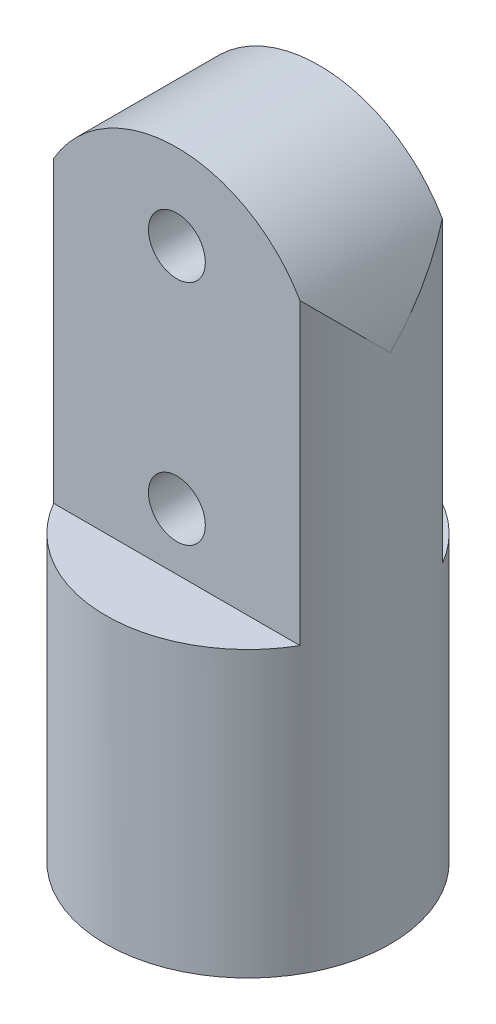
ISO-10303-21;
HEADER;
FILE_DESCRIPTION(('STEP AP214'),'2;1');
FILE_NAME('part.step','',(''),(''),'','','');
FILE_SCHEMA(('AUTOMOTIVE_DESIGN { 1 0 10303 214 1 1 1 1 }'));
ENDSEC;
DATA;
#1=APPLICATION_CONTEXT('core data for automotive mechanical design processes');
#2=APPLICATION_PROTOCOL_DEFINITION('international standard','automotive_design',2000,#1);
#3=PRODUCT_CONTEXT('',#1,'mechanical');
#4=PRODUCT('Part','Part','',(#3));
#5=PRODUCT_RELATED_PRODUCT_CATEGORY('part','',(#4));
#6=PRODUCT_DEFINITION_FORMATION('','',#4);
#7=PRODUCT_DEFINITION_CONTEXT('part definition',#1,'design');
#8=PRODUCT_DEFINITION('design','',#6,#7);
#9=PRODUCT_DEFINITION_SHAPE('','',#8);
#10=(LENGTH_UNIT() NAMED_UNIT(*) SI_UNIT(.MILLI.,.METRE.));
#11=(NAMED_UNIT(*) PLANE_ANGLE_UNIT() SI_UNIT($,.RADIAN.));
#12=(NAMED_UNIT(*) SI_UNIT($,.STERADIAN.) SOLID_ANGLE_UNIT());
#13=UNCERTAINTY_MEASURE_WITH_UNIT(LENGTH_MEASURE(1.E-05),#10,'distance_accuracy_value','');
#14=(GEOMETRIC_REPRESENTATION_CONTEXT(3) GLOBAL_UNCERTAINTY_ASSIGNED_CONTEXT((#13)) GLOBAL_UNIT_ASSIGNED_CONTEXT((#10,
#11,#12)) REPRESENTATION_CONTEXT('',''));
#15=CARTESIAN_POINT('',(0.,0.,0.));
#16=DIRECTION('',(0.,0.,1.));
#17=DIRECTION('',(1.,0.,0.));
#18=AXIS2_PLACEMENT_3D('',#15,#16,#17);
#19=CARTESIAN_POINT('',(0.,90.,-12.5));
#20=DIRECTION('',(0.,0.,-1.));
#21=DIRECTION('',(-1.,0.,0.));
#22=AXIS2_PLACEMENT_3D('',#19,#20,#21);
#23=PLANE('',#22);
#24=CARTESIAN_POINT('',(0.,100.,-12.5));
#25=DIRECTION('',(0.,0.,-1.));
#26=DIRECTION('',(-1.,0.,0.));
#27=AXIS2_PLACEMENT_3D('',#24,#25,#26);
#28=CIRCLE('',#27,5.00000000000001);
#29=CARTESIAN_POINT('',(-5.00000000000001,100.,-12.5));
#30=VERTEX_POINT('',#29);
#31=EDGE_CURVE('E140',#30,#30,#28,.T.);
#32=ORIENTED_EDGE('',*,*,#31,.F.);
#33=EDGE_LOOP('',(#32));
#34=FACE_BOUND('',#33,.T.);
#35=CARTESIAN_POINT('',(0.,60.,-12.5));
#36=DIRECTION('',(0.,0.,-1.));
#37=DIRECTION('',(-1.,0.,0.));
#38=AXIS2_PLACEMENT_3D('',#35,#36,#37);
#39=CIRCLE('',#38,5.);
#40=CARTESIAN_POINT('',(-5.,60.,-12.5));
#41=VERTEX_POINT('',#40);
#42=EDGE_CURVE('E145',#41,#41,#39,.T.);
#43=ORIENTED_EDGE('',*,*,#42,.F.);
#44=EDGE_LOOP('',(#43));
#45=FACE_BOUND('',#44,.T.);
#46=CARTESIAN_POINT('',(0.,90.,-12.5));
#47=DIRECTION('',(0.,0.,1.));
#48=DIRECTION('',(-1.,0.,0.));
#49=AXIS2_PLACEMENT_3D('',#46,#47,#48);
#50=CIRCLE('',#49,25.);
#51=CARTESIAN_POINT('',(21.650635094611,102.5,-12.5));
#52=VERTEX_POINT('',#51);
#53=CARTESIAN_POINT('',(-21.650635094611,102.5,-12.5));
#54=VERTEX_POINT('',#53);
#55=EDGE_CURVE('E92',#52,#54,#50,.T.);
#56=ORIENTED_EDGE('',*,*,#55,.F.);
#57=DIRECTION('',(0.,-1.,0.));
#58=VECTOR('',#57,1.);
#59=CARTESIAN_POINT('',(21.650635094611,115.,-12.5));
#60=LINE('',#59,#58);
#61=CARTESIAN_POINT('',(21.650635094611,50.,-12.5));
#62=VERTEX_POINT('',#61);
#63=EDGE_CURVE('E91',#52,#62,#60,.T.);
#64=ORIENTED_EDGE('',*,*,#63,.T.);
#65=DIRECTION('',(1.,0.,0.));
#66=VECTOR('',#65,1.);
#67=CARTESIAN_POINT('',(-25.,50.,-12.5));
#68=LINE('',#67,#66);
#69=CARTESIAN_POINT('',(-21.650635094611,50.,-12.5));
#70=VERTEX_POINT('',#69);
#71=EDGE_CURVE('E11',#70,#62,#68,.T.);
#72=ORIENTED_EDGE('',*,*,#71,.F.);
#73=DIRECTION('',(0.,-1.,0.));
#74=VECTOR('',#73,1.);
#75=CARTESIAN_POINT('',(-21.650635094611,115.,-12.5));
#76=LINE('',#75,#74);
#77=EDGE_CURVE('E57',#54,#70,#76,.T.);
#78=ORIENTED_EDGE('',*,*,#77,.F.);
#79=EDGE_LOOP('',(#56,#64,#72,#78));
#80=FACE_BOUND('',#79,.T.);
#81=ADVANCED_FACE('F39',(#34,#45,#80),#23,.T.);
#82=CARTESIAN_POINT('',(0.,90.,12.5));
#83=DIRECTION('',(0.,0.,-1.));
#84=DIRECTION('',(-1.,0.,0.));
#85=AXIS2_PLACEMENT_3D('',#82,#83,#84);
#86=CYLINDRICAL_SURFACE('',#85,25.);
#87=CARTESIAN_POINT('',(0.,90.,0.));
#88=DIRECTION('',(0.,-0.707106781186547,-0.707106781186547));
#89=DIRECTION('',(0.,0.707106781186547,-0.707106781186547));
#90=AXIS2_PLACEMENT_3D('',#87,#88,#89);
#91=ELLIPSE('',#90,35.3553390593274,25.);
#92=CARTESIAN_POINT('',(25.,90.,0.));
#93=VERTEX_POINT('',#92);
#94=EDGE_CURVE('E95',#52,#93,#91,.T.);
#95=ORIENTED_EDGE('',*,*,#94,.F.);
#96=ORIENTED_EDGE('',*,*,#55,.T.);
#97=CARTESIAN_POINT('',(0.,90.,0.));
#98=DIRECTION('',(0.,-0.707106781186547,-0.707106781186547));
#99=DIRECTION('',(0.,0.707106781186547,-0.707106781186547));
#100=AXIS2_PLACEMENT_3D('',#97,#98,#99);
#101=ELLIPSE('',#100,35.3553390593274,25.);
#102=CARTESIAN_POINT('',(-25.,90.,0.));
#103=VERTEX_POINT('',#102);
#104=EDGE_CURVE('E119',#103,#54,#101,.T.);
#105=ORIENTED_EDGE('',*,*,#104,.F.);
#106=CARTESIAN_POINT('',(0.,90.,0.));
#107=DIRECTION('',(0.,0.707106781186547,-0.707106781186547));
#108=DIRECTION('',(0.,-0.707106781186547,-0.707106781186547));
#109=AXIS2_PLACEMENT_3D('',#106,#107,#108);
#110=ELLIPSE('',#109,35.3553390593274,25.);
#111=CARTESIAN_POINT('',(-21.650635094611,102.5,12.5));
#112=VERTEX_POINT('',#111);
#113=EDGE_CURVE('E132',#112,#103,#110,.F.);
#114=ORIENTED_EDGE('',*,*,#113,.F.);
#115=CARTESIAN_POINT('',(0.,90.,12.5));
#116=DIRECTION('',(0.,0.,1.));
#117=DIRECTION('',(-1.,0.,0.));
#118=AXIS2_PLACEMENT_3D('',#115,#116,#117);
#119=CIRCLE('',#118,25.);
#120=CARTESIAN_POINT('',(21.650635094611,102.5,12.5));
#121=VERTEX_POINT('',#120);
#122=EDGE_CURVE('E117',#121,#112,#119,.T.);
#123=ORIENTED_EDGE('',*,*,#122,.F.);
#124=CARTESIAN_POINT('',(0.,90.,0.));
#125=DIRECTION('',(0.,0.707106781186547,-0.707106781186547));
#126=DIRECTION('',(0.,-0.707106781186547,-0.707106781186547));
#127=AXIS2_PLACEMENT_3D('',#124,#125,#126);
#128=ELLIPSE('',#127,35.3553390593274,25.);
#129=EDGE_CURVE('E126',#121,#93,#128,.T.);
#130=ORIENTED_EDGE('',*,*,#129,.T.);
#131=EDGE_LOOP('',(#95,#96,#105,#114,#123,#130));
#132=FACE_BOUND('',#131,.T.);
#133=ADVANCED_FACE('F163',(#132),#86,.T.);
#134=CARTESIAN_POINT('',(0.,90.,12.5));
#135=DIRECTION('',(0.,0.,-1.));
#136=DIRECTION('',(-1.,0.,0.));
#137=AXIS2_PLACEMENT_3D('',#134,#135,#136);
#138=PLANE('',#137);
#139=CARTESIAN_POINT('',(0.,100.,12.5));
#140=DIRECTION('',(0.,0.,1.));
#141=DIRECTION('',(1.,0.,0.));
#142=AXIS2_PLACEMENT_3D('',#139,#140,#141);
#143=CIRCLE('',#142,5.00000000000001);
#144=CARTESIAN_POINT('',(5.00000000000001,100.,12.5));
#145=VERTEX_POINT('',#144);
#146=EDGE_CURVE('E149',#145,#145,#143,.T.);
#147=ORIENTED_EDGE('',*,*,#146,.F.);
#148=EDGE_LOOP('',(#147));
#149=FACE_BOUND('',#148,.T.);
#150=CARTESIAN_POINT('',(0.,60.,12.5));
#151=DIRECTION('',(0.,0.,1.));
#152=DIRECTION('',(1.,0.,0.));
#153=AXIS2_PLACEMENT_3D('',#150,#151,#152);
#154=CIRCLE('',#153,5.);
#155=CARTESIAN_POINT('',(5.,60.,12.5));
#156=VERTEX_POINT('',#155);
#157=EDGE_CURVE('E150',#156,#156,#154,.T.);
#158=ORIENTED_EDGE('',*,*,#157,.F.);
#159=EDGE_LOOP('',(#158));
#160=FACE_BOUND('',#159,.T.);
#161=DIRECTION('',(0.,-1.,0.));
#162=VECTOR('',#161,1.);
#163=CARTESIAN_POINT('',(-21.650635094611,115.,12.5));
#164=LINE('',#163,#162);
#165=CARTESIAN_POINT('',(-21.650635094611,50.,12.5));
#166=VERTEX_POINT('',#165);
#167=EDGE_CURVE('E96',#112,#166,#164,.T.);
#168=ORIENTED_EDGE('',*,*,#167,.T.);
#169=DIRECTION('',(1.,0.,0.));
#170=VECTOR('',#169,1.);
#171=CARTESIAN_POINT('',(-25.,50.,12.5));
#172=LINE('',#171,#170);
#173=CARTESIAN_POINT('',(21.650635094611,50.,12.5));
#174=VERTEX_POINT('',#173);
#175=EDGE_CURVE('E49',#166,#174,#172,.T.);
#176=ORIENTED_EDGE('',*,*,#175,.T.);
#177=DIRECTION('',(0.,-1.,0.));
#178=VECTOR('',#177,1.);
#179=CARTESIAN_POINT('',(21.650635094611,115.,12.5));
#180=LINE('',#179,#178);
#181=EDGE_CURVE('E64',#121,#174,#180,.T.);
#182=ORIENTED_EDGE('',*,*,#181,.F.);
#183=ORIENTED_EDGE('',*,*,#122,.T.);
#184=EDGE_LOOP('',(#168,#176,#182,#183));
#185=FACE_BOUND('',#184,.T.);
#186=ADVANCED_FACE('F160',(#149,#160,#185),#138,.F.);
#187=CARTESIAN_POINT('',(0.,50.,0.));
#188=DIRECTION('',(0.,1.,0.));
#189=DIRECTION('',(0.,0.,1.));
#190=AXIS2_PLACEMENT_3D('',#187,#188,#189);
#191=PLANE('',#190);
#192=CARTESIAN_POINT('',(0.,50.,0.));
#193=DIRECTION('',(0.,1.,0.));
#194=DIRECTION('',(0.,0.,1.));
#195=AXIS2_PLACEMENT_3D('',#192,#193,#194);
#196=CIRCLE('',#195,25.);
#197=EDGE_CURVE('E100',#62,#70,#196,.T.);
#198=ORIENTED_EDGE('',*,*,#197,.T.);
#199=ORIENTED_EDGE('',*,*,#71,.T.);
#200=EDGE_LOOP('',(#198,#199));
#201=FACE_BOUND('',#200,.T.);
#202=ADVANCED_FACE('F99',(#201),#191,.T.);
#203=ORIENTED_EDGE('',*,*,#175,.F.);
#204=EDGE_CURVE('E103',#166,#174,#196,.T.);
#205=ORIENTED_EDGE('',*,*,#204,.T.);
#206=EDGE_LOOP('',(#203,#205));
#207=FACE_BOUND('',#206,.T.);
#208=ADVANCED_FACE('F171',(#207),#191,.T.);
#209=CARTESIAN_POINT('',(0.,0.,0.));
#210=DIRECTION('',(0.,1.,0.));
#211=DIRECTION('',(0.,0.,1.));
#212=AXIS2_PLACEMENT_3D('',#209,#210,#211);
#213=PLANE('',#212);
#214=CARTESIAN_POINT('',(0.,0.,0.));
#215=DIRECTION('',(0.,1.,0.));
#216=DIRECTION('',(0.,0.,1.));
#217=AXIS2_PLACEMENT_3D('',#214,#215,#216);
#218=CIRCLE('',#217,25.);
#219=CARTESIAN_POINT('',(0.,0.,25.));
#220=VERTEX_POINT('',#219);
#221=EDGE_CURVE('E43',#220,#220,#218,.T.);
#222=ORIENTED_EDGE('',*,*,#221,.F.);
#223=EDGE_LOOP('',(#222));
#224=FACE_BOUND('',#223,.T.);
#225=CARTESIAN_POINT('',(0.,0.,0.));
#226=DIRECTION('',(0.,1.,0.));
#227=DIRECTION('',(0.,0.,1.));
#228=AXIS2_PLACEMENT_3D('',#225,#226,#227);
#229=CIRCLE('',#228,10.);
#230=CARTESIAN_POINT('',(0.,0.,10.));
#231=VERTEX_POINT('',#230);
#232=EDGE_CURVE('E109',#231,#231,#229,.T.);
#233=ORIENTED_EDGE('',*,*,#232,.T.);
#234=EDGE_LOOP('',(#233));
#235=FACE_BOUND('',#234,.T.);
#236=ADVANCED_FACE('F173',(#224,#235),#213,.F.);
#237=CARTESIAN_POINT('',(0.,50.,0.));
#238=DIRECTION('',(0.,-1.,0.));
#239=DIRECTION('',(0.,0.,-1.));
#240=AXIS2_PLACEMENT_3D('',#237,#238,#239);
#241=CYLINDRICAL_SURFACE('',#240,25.);
#242=ORIENTED_EDGE('',*,*,#197,.F.);
#243=ORIENTED_EDGE('',*,*,#63,.F.);
#244=ORIENTED_EDGE('',*,*,#94,.T.);
#245=ORIENTED_EDGE('',*,*,#129,.F.);
#246=ORIENTED_EDGE('',*,*,#181,.T.);
#247=ORIENTED_EDGE('',*,*,#204,.F.);
#248=ORIENTED_EDGE('',*,*,#167,.F.);
#249=ORIENTED_EDGE('',*,*,#113,.T.);
#250=ORIENTED_EDGE('',*,*,#104,.T.);
#251=ORIENTED_EDGE('',*,*,#77,.T.);
#252=EDGE_LOOP('',(#242,#243,#244,#245,#246,#247,#248,#249,#250,#251));
#253=FACE_BOUND('',#252,.T.);
#254=ORIENTED_EDGE('',*,*,#221,.T.);
#255=EDGE_LOOP('',(#254));
#256=FACE_BOUND('',#255,.T.);
#257=ADVANCED_FACE('F41',(#253,#256),#241,.T.);
#258=CARTESIAN_POINT('',(0.,50.,0.));
#259=DIRECTION('',(0.,-1.,0.));
#260=DIRECTION('',(0.,0.,-1.));
#261=AXIS2_PLACEMENT_3D('',#258,#259,#260);
#262=CYLINDRICAL_SURFACE('',#261,10.);
#263=CARTESIAN_POINT('',(0.,50.,0.));
#264=DIRECTION('',(0.,1.,0.));
#265=DIRECTION('',(0.,0.,1.));
#266=AXIS2_PLACEMENT_3D('',#263,#264,#265);
#267=CIRCLE('',#266,10.);
#268=CARTESIAN_POINT('',(0.,50.,10.));
#269=VERTEX_POINT('',#268);
#270=EDGE_CURVE('E113',#269,#269,#267,.T.);
#271=ORIENTED_EDGE('',*,*,#270,.T.);
#272=EDGE_LOOP('',(#271));
#273=FACE_BOUND('',#272,.T.);
#274=ORIENTED_EDGE('',*,*,#232,.F.);
#275=EDGE_LOOP('',(#274));
#276=FACE_BOUND('',#275,.T.);
#277=ADVANCED_FACE('F196',(#273,#276),#262,.F.);
#278=CARTESIAN_POINT('',(-25.,50.,12.5));
#279=DIRECTION('',(0.,1.,0.));
#280=DIRECTION('',(0.,0.,1.));
#281=AXIS2_PLACEMENT_3D('',#278,#279,#280);
#282=PLANE('',#281);
#283=ORIENTED_EDGE('',*,*,#270,.F.);
#284=EDGE_LOOP('',(#283));
#285=FACE_BOUND('',#284,.T.);
#286=ADVANCED_FACE('F193',(#285),#282,.F.);
#287=CARTESIAN_POINT('',(0.,60.,-25.));
#288=DIRECTION('',(0.,0.,1.));
#289=DIRECTION('',(1.,0.,0.));
#290=AXIS2_PLACEMENT_3D('',#287,#288,#289);
#291=CYLINDRICAL_SURFACE('',#290,5.);
#292=ORIENTED_EDGE('',*,*,#42,.T.);
#293=EDGE_LOOP('',(#292));
#294=FACE_BOUND('',#293,.T.);
#295=ORIENTED_EDGE('',*,*,#157,.T.);
#296=EDGE_LOOP('',(#295));
#297=FACE_BOUND('',#296,.T.);
#298=ADVANCED_FACE('F195',(#294,#297),#291,.F.);
#299=CARTESIAN_POINT('',(0.,100.,-25.));
#300=DIRECTION('',(0.,0.,1.));
#301=DIRECTION('',(1.,0.,0.));
#302=AXIS2_PLACEMENT_3D('',#299,#300,#301);
#303=CYLINDRICAL_SURFACE('',#302,5.00000000000001);
#304=ORIENTED_EDGE('',*,*,#31,.T.);
#305=EDGE_LOOP('',(#304));
#306=FACE_BOUND('',#305,.T.);
#307=ORIENTED_EDGE('',*,*,#146,.T.);
#308=EDGE_LOOP('',(#307));
#309=FACE_BOUND('',#308,.T.);
#310=ADVANCED_FACE('F158',(#306,#309),#303,.F.);
#311=CLOSED_SHELL('',(#81,#133,#186,#202,#208,#236,#257,#277,#286,#298,#310));
#312=MANIFOLD_SOLID_BREP('B2',#311);
#313=ADVANCED_BREP_SHAPE_REPRESENTATION('',(#18,#312),#14);
#314=SHAPE_DEFINITION_REPRESENTATION(#9,#313);
ENDSEC;
END-ISO-10303-21;
